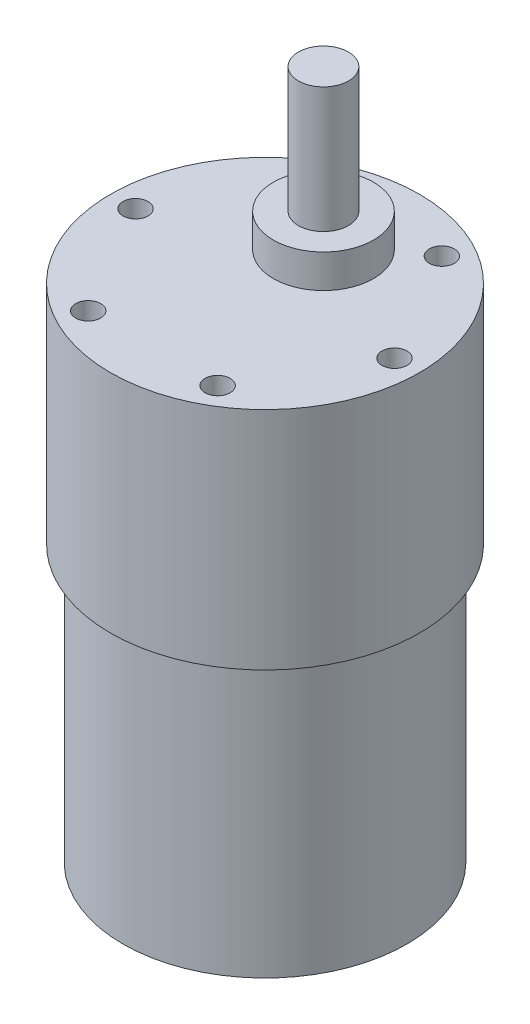
ISO-10303-21;
HEADER;
FILE_DESCRIPTION(('STEP AP214'),'2;1');
FILE_NAME('part.step','',(''),(''),'','','');
FILE_SCHEMA(('AUTOMOTIVE_DESIGN { 1 0 10303 214 1 1 1 1 }'));
ENDSEC;
DATA;
#1=APPLICATION_CONTEXT('core data for automotive mechanical design processes');
#2=APPLICATION_PROTOCOL_DEFINITION('international standard','automotive_design',2000,#1);
#3=PRODUCT_CONTEXT('',#1,'mechanical');
#4=PRODUCT('Part','Part','',(#3));
#5=PRODUCT_RELATED_PRODUCT_CATEGORY('part','',(#4));
#6=PRODUCT_DEFINITION_FORMATION('','',#4);
#7=PRODUCT_DEFINITION_CONTEXT('part definition',#1,'design');
#8=PRODUCT_DEFINITION('design','',#6,#7);
#9=PRODUCT_DEFINITION_SHAPE('','',#8);
#10=(LENGTH_UNIT() NAMED_UNIT(*) SI_UNIT(.MILLI.,.METRE.));
#11=(NAMED_UNIT(*) PLANE_ANGLE_UNIT() SI_UNIT($,.RADIAN.));
#12=(NAMED_UNIT(*) SI_UNIT($,.STERADIAN.) SOLID_ANGLE_UNIT());
#13=UNCERTAINTY_MEASURE_WITH_UNIT(LENGTH_MEASURE(1.E-05),#10,'distance_accuracy_value','');
#14=(GEOMETRIC_REPRESENTATION_CONTEXT(3) GLOBAL_UNCERTAINTY_ASSIGNED_CONTEXT((#13)) GLOBAL_UNIT_ASSIGNED_CONTEXT((#10,
#11,#12)) REPRESENTATION_CONTEXT('',''));
#15=CARTESIAN_POINT('',(0.,0.,0.));
#16=DIRECTION('',(0.,0.,1.));
#17=DIRECTION('',(1.,0.,0.));
#18=AXIS2_PLACEMENT_3D('',#15,#16,#17);
#19=CARTESIAN_POINT('',(0.,64.,-7.));
#20=DIRECTION('',(0.,1.,0.));
#21=DIRECTION('',(0.,0.,1.));
#22=AXIS2_PLACEMENT_3D('',#19,#20,#21);
#23=PLANE('',#22);
#24=CARTESIAN_POINT('',(0.,64.,-7.));
#25=DIRECTION('',(0.,1.,0.));
#26=DIRECTION('',(0.,0.,1.));
#27=AXIS2_PLACEMENT_3D('',#24,#25,#26);
#28=CIRCLE('',#27,6.);
#29=CARTESIAN_POINT('',(0.,64.,-0.999999999999999));
#30=VERTEX_POINT('',#29);
#31=EDGE_CURVE('E49',#30,#30,#28,.T.);
#32=ORIENTED_EDGE('',*,*,#31,.T.);
#33=EDGE_LOOP('',(#32));
#34=FACE_BOUND('',#33,.T.);
#35=CARTESIAN_POINT('',(0.,64.,-7.));
#36=DIRECTION('',(0.,1.,0.));
#37=DIRECTION('',(0.,0.,1.));
#38=AXIS2_PLACEMENT_3D('',#35,#36,#37);
#39=CIRCLE('',#38,3.);
#40=CARTESIAN_POINT('',(0.,64.,-4.));
#41=VERTEX_POINT('',#40);
#42=EDGE_CURVE('E58',#41,#41,#39,.T.);
#43=ORIENTED_EDGE('',*,*,#42,.F.);
#44=EDGE_LOOP('',(#43));
#45=FACE_BOUND('',#44,.T.);
#46=ADVANCED_FACE('F33',(#34,#45),#23,.T.);
#47=CARTESIAN_POINT('',(0.,60.,0.));
#48=DIRECTION('',(0.,1.,0.));
#49=DIRECTION('',(0.,0.,1.));
#50=AXIS2_PLACEMENT_3D('',#47,#48,#49);
#51=PLANE('',#50);
#52=CARTESIAN_POINT('',(-7.75000000000005,60.,-13.4233937586579));
#53=DIRECTION('',(0.,1.,0.));
#54=DIRECTION('',(0.,0.,1.));
#55=AXIS2_PLACEMENT_3D('',#52,#53,#54);
#56=CIRCLE('',#55,1.50000000000099);
#57=CARTESIAN_POINT('',(-7.75000000000005,60.,-11.9233937586569));
#58=VERTEX_POINT('',#57);
#59=EDGE_CURVE('E94',#58,#58,#56,.T.);
#60=ORIENTED_EDGE('',*,*,#59,.F.);
#61=EDGE_LOOP('',(#60));
#62=FACE_BOUND('',#61,.T.);
#63=CARTESIAN_POINT('',(-15.4999999999993,60.,1.36809671811449E-12));
#64=DIRECTION('',(0.,1.,0.));
#65=DIRECTION('',(0.,0.,1.));
#66=AXIS2_PLACEMENT_3D('',#63,#64,#65);
#67=CIRCLE('',#66,1.50000000000155);
#68=CARTESIAN_POINT('',(-15.4999999999993,60.,1.50000000000292));
#69=VERTEX_POINT('',#68);
#70=EDGE_CURVE('E88',#69,#69,#67,.T.);
#71=ORIENTED_EDGE('',*,*,#70,.F.);
#72=EDGE_LOOP('',(#71));
#73=FACE_BOUND('',#72,.T.);
#74=CARTESIAN_POINT('',(-7.74999999999845,60.,13.4233937586597));
#75=DIRECTION('',(0.,1.,0.));
#76=DIRECTION('',(0.,0.,1.));
#77=AXIS2_PLACEMENT_3D('',#74,#75,#76);
#78=CIRCLE('',#77,1.50000000000126);
#79=CARTESIAN_POINT('',(-7.74999999999845,60.,14.923393758661));
#80=VERTEX_POINT('',#79);
#81=EDGE_CURVE('E82',#80,#80,#78,.T.);
#82=ORIENTED_EDGE('',*,*,#81,.F.);
#83=EDGE_LOOP('',(#82));
#84=FACE_BOUND('',#83,.T.);
#85=CARTESIAN_POINT('',(7.75000000000155,60.,13.4233937586588));
#86=DIRECTION('',(0.,1.,0.));
#87=DIRECTION('',(0.,0.,1.));
#88=AXIS2_PLACEMENT_3D('',#85,#86,#87);
#89=CIRCLE('',#88,1.50000000000038);
#90=CARTESIAN_POINT('',(7.75000000000155,60.,14.9233937586592));
#91=VERTEX_POINT('',#90);
#92=EDGE_CURVE('E76',#91,#91,#89,.T.);
#93=ORIENTED_EDGE('',*,*,#92,.F.);
#94=EDGE_LOOP('',(#93));
#95=FACE_BOUND('',#94,.T.);
#96=CARTESIAN_POINT('',(15.5000000000008,60.,-4.75643164487524E-13));
#97=DIRECTION('',(0.,1.,0.));
#98=DIRECTION('',(0.,0.,1.));
#99=AXIS2_PLACEMENT_3D('',#96,#97,#98);
#100=CIRCLE('',#99,1.49999999999976);
#101=CARTESIAN_POINT('',(15.5000000000008,60.,1.49999999999929));
#102=VERTEX_POINT('',#101);
#103=EDGE_CURVE('E70',#102,#102,#100,.T.);
#104=ORIENTED_EDGE('',*,*,#103,.F.);
#105=EDGE_LOOP('',(#104));
#106=FACE_BOUND('',#105,.T.);
#107=CARTESIAN_POINT('',(7.74999999999997,60.,-13.4233937586588));
#108=DIRECTION('',(0.,1.,0.));
#109=DIRECTION('',(0.,0.,1.));
#110=AXIS2_PLACEMENT_3D('',#107,#108,#109);
#111=CIRCLE('',#110,1.5);
#112=CARTESIAN_POINT('',(7.74999999999997,60.,-11.9233937586588));
#113=VERTEX_POINT('',#112);
#114=EDGE_CURVE('E64',#113,#113,#111,.T.);
#115=ORIENTED_EDGE('',*,*,#114,.F.);
#116=EDGE_LOOP('',(#115));
#117=FACE_BOUND('',#116,.T.);
#118=CARTESIAN_POINT('',(0.,60.,0.));
#119=DIRECTION('',(0.,1.,0.));
#120=DIRECTION('',(0.,0.,1.));
#121=AXIS2_PLACEMENT_3D('',#118,#119,#120);
#122=CIRCLE('',#121,18.5);
#123=CARTESIAN_POINT('',(0.,60.,18.5));
#124=VERTEX_POINT('',#123);
#125=EDGE_CURVE('E44',#124,#124,#122,.T.);
#126=ORIENTED_EDGE('',*,*,#125,.T.);
#127=EDGE_LOOP('',(#126));
#128=FACE_BOUND('',#127,.T.);
#129=CARTESIAN_POINT('',(0.,60.,-7.));
#130=DIRECTION('',(0.,1.,0.));
#131=DIRECTION('',(0.,0.,1.));
#132=AXIS2_PLACEMENT_3D('',#129,#130,#131);
#133=CIRCLE('',#132,6.);
#134=CARTESIAN_POINT('',(0.,60.,-0.999999999999999));
#135=VERTEX_POINT('',#134);
#136=EDGE_CURVE('E52',#135,#135,#133,.T.);
#137=ORIENTED_EDGE('',*,*,#136,.F.);
#138=EDGE_LOOP('',(#137));
#139=FACE_BOUND('',#138,.T.);
#140=ADVANCED_FACE('F109',(#62,#73,#84,#95,#106,#117,#128,#139),#51,.T.);
#141=CARTESIAN_POINT('',(0.,33.,0.));
#142=DIRECTION('',(0.,-1.,0.));
#143=DIRECTION('',(0.,0.,-1.));
#144=AXIS2_PLACEMENT_3D('',#141,#142,#143);
#145=CYLINDRICAL_SURFACE('',#144,17.);
#146=CARTESIAN_POINT('',(0.,33.,0.));
#147=DIRECTION('',(0.,1.,0.));
#148=DIRECTION('',(0.,0.,1.));
#149=AXIS2_PLACEMENT_3D('',#146,#147,#148);
#150=CIRCLE('',#149,17.);
#151=CARTESIAN_POINT('',(0.,33.,17.));
#152=VERTEX_POINT('',#151);
#153=EDGE_CURVE('E10',#152,#152,#150,.T.);
#154=ORIENTED_EDGE('',*,*,#153,.F.);
#155=EDGE_LOOP('',(#154));
#156=FACE_BOUND('',#155,.T.);
#157=CARTESIAN_POINT('',(0.,0.,0.));
#158=DIRECTION('',(0.,1.,0.));
#159=DIRECTION('',(0.,0.,1.));
#160=AXIS2_PLACEMENT_3D('',#157,#158,#159);
#161=CIRCLE('',#160,17.);
#162=CARTESIAN_POINT('',(0.,0.,17.));
#163=VERTEX_POINT('',#162);
#164=EDGE_CURVE('E37',#163,#163,#161,.T.);
#165=ORIENTED_EDGE('',*,*,#164,.T.);
#166=EDGE_LOOP('',(#165));
#167=FACE_BOUND('',#166,.T.);
#168=ADVANCED_FACE('F35',(#156,#167),#145,.T.);
#169=CARTESIAN_POINT('',(0.,0.,0.));
#170=DIRECTION('',(0.,1.,0.));
#171=DIRECTION('',(0.,0.,1.));
#172=AXIS2_PLACEMENT_3D('',#169,#170,#171);
#173=PLANE('',#172);
#174=ORIENTED_EDGE('',*,*,#164,.F.);
#175=EDGE_LOOP('',(#174));
#176=FACE_BOUND('',#175,.T.);
#177=ADVANCED_FACE('F273',(#176),#173,.F.);
#178=CARTESIAN_POINT('',(0.,33.,0.));
#179=DIRECTION('',(0.,1.,0.));
#180=DIRECTION('',(0.,0.,1.));
#181=AXIS2_PLACEMENT_3D('',#178,#179,#180);
#182=PLANE('',#181);
#183=CARTESIAN_POINT('',(0.,33.,0.));
#184=DIRECTION('',(0.,1.,0.));
#185=DIRECTION('',(0.,0.,1.));
#186=AXIS2_PLACEMENT_3D('',#183,#184,#185);
#187=CIRCLE('',#186,18.5);
#188=CARTESIAN_POINT('',(0.,33.,18.5));
#189=VERTEX_POINT('',#188);
#190=EDGE_CURVE('E46',#189,#189,#187,.T.);
#191=ORIENTED_EDGE('',*,*,#190,.F.);
#192=EDGE_LOOP('',(#191));
#193=FACE_BOUND('',#192,.T.);
#194=ORIENTED_EDGE('',*,*,#153,.T.);
#195=EDGE_LOOP('',(#194));
#196=FACE_BOUND('',#195,.T.);
#197=ADVANCED_FACE('F140',(#193,#196),#182,.F.);
#198=CARTESIAN_POINT('',(0.,60.,0.));
#199=DIRECTION('',(0.,-1.,0.));
#200=DIRECTION('',(0.,0.,-1.));
#201=AXIS2_PLACEMENT_3D('',#198,#199,#200);
#202=CYLINDRICAL_SURFACE('',#201,18.5);
#203=ORIENTED_EDGE('',*,*,#125,.F.);
#204=EDGE_LOOP('',(#203));
#205=FACE_BOUND('',#204,.T.);
#206=ORIENTED_EDGE('',*,*,#190,.T.);
#207=EDGE_LOOP('',(#206));
#208=FACE_BOUND('',#207,.T.);
#209=ADVANCED_FACE('F130',(#205,#208),#202,.T.);
#210=CARTESIAN_POINT('',(0.,64.,-7.));
#211=DIRECTION('',(0.,-1.,0.));
#212=DIRECTION('',(0.,0.,-1.));
#213=AXIS2_PLACEMENT_3D('',#210,#211,#212);
#214=CYLINDRICAL_SURFACE('',#213,6.);
#215=ORIENTED_EDGE('',*,*,#31,.F.);
#216=EDGE_LOOP('',(#215));
#217=FACE_BOUND('',#216,.T.);
#218=ORIENTED_EDGE('',*,*,#136,.T.);
#219=EDGE_LOOP('',(#218));
#220=FACE_BOUND('',#219,.T.);
#221=ADVANCED_FACE('F127',(#217,#220),#214,.T.);
#222=CARTESIAN_POINT('',(0.,79.,-7.));
#223=DIRECTION('',(0.,-1.,0.));
#224=DIRECTION('',(0.,0.,-1.));
#225=AXIS2_PLACEMENT_3D('',#222,#223,#224);
#226=CYLINDRICAL_SURFACE('',#225,3.);
#227=CARTESIAN_POINT('',(0.,79.,-7.));
#228=DIRECTION('',(0.,1.,0.));
#229=DIRECTION('',(0.,0.,1.));
#230=AXIS2_PLACEMENT_3D('',#227,#228,#229);
#231=CIRCLE('',#230,3.);
#232=CARTESIAN_POINT('',(0.,79.,-4.));
#233=VERTEX_POINT('',#232);
#234=EDGE_CURVE('E55',#233,#233,#231,.T.);
#235=ORIENTED_EDGE('',*,*,#234,.F.);
#236=EDGE_LOOP('',(#235));
#237=FACE_BOUND('',#236,.T.);
#238=ORIENTED_EDGE('',*,*,#42,.T.);
#239=EDGE_LOOP('',(#238));
#240=FACE_BOUND('',#239,.T.);
#241=ADVANCED_FACE('F129',(#237,#240),#226,.T.);
#242=CARTESIAN_POINT('',(0.,79.,-7.));
#243=DIRECTION('',(0.,1.,0.));
#244=DIRECTION('',(0.,0.,1.));
#245=AXIS2_PLACEMENT_3D('',#242,#243,#244);
#246=PLANE('',#245);
#247=ORIENTED_EDGE('',*,*,#234,.T.);
#248=EDGE_LOOP('',(#247));
#249=FACE_BOUND('',#248,.T.);
#250=ADVANCED_FACE('F137',(#249),#246,.T.);
#251=CARTESIAN_POINT('',(7.74999999999997,55.,-13.4233937586588));
#252=DIRECTION('',(0.,1.,0.));
#253=DIRECTION('',(0.,0.,1.));
#254=AXIS2_PLACEMENT_3D('',#251,#252,#253);
#255=CYLINDRICAL_SURFACE('',#254,1.5);
#256=CARTESIAN_POINT('',(7.74999999999997,55.,-13.4233937586588));
#257=DIRECTION('',(0.,1.,0.));
#258=DIRECTION('',(0.,0.,1.));
#259=AXIS2_PLACEMENT_3D('',#256,#257,#258);
#260=CIRCLE('',#259,1.5);
#261=CARTESIAN_POINT('',(7.74999999999997,55.,-11.9233937586588));
#262=VERTEX_POINT('',#261);
#263=EDGE_CURVE('E61',#262,#262,#260,.T.);
#264=ORIENTED_EDGE('',*,*,#263,.F.);
#265=EDGE_LOOP('',(#264));
#266=FACE_BOUND('',#265,.T.);
#267=ORIENTED_EDGE('',*,*,#114,.T.);
#268=EDGE_LOOP('',(#267));
#269=FACE_BOUND('',#268,.T.);
#270=ADVANCED_FACE('F153',(#266,#269),#255,.F.);
#271=CARTESIAN_POINT('',(7.74999999999997,55.,-13.4233937586588));
#272=DIRECTION('',(0.,1.,0.));
#273=DIRECTION('',(0.,0.,1.));
#274=AXIS2_PLACEMENT_3D('',#271,#272,#273);
#275=PLANE('',#274);
#276=ORIENTED_EDGE('',*,*,#263,.T.);
#277=EDGE_LOOP('',(#276));
#278=FACE_BOUND('',#277,.T.);
#279=ADVANCED_FACE('F157',(#278),#275,.T.);
#280=CARTESIAN_POINT('',(15.5000000000008,55.,-4.75643164487524E-13));
#281=DIRECTION('',(0.,1.,0.));
#282=DIRECTION('',(0.,0.,1.));
#283=AXIS2_PLACEMENT_3D('',#280,#281,#282);
#284=CYLINDRICAL_SURFACE('',#283,1.49999999999976);
#285=CARTESIAN_POINT('',(15.5000000000008,55.,-4.75643164487524E-13));
#286=DIRECTION('',(0.,1.,0.));
#287=DIRECTION('',(0.,0.,1.));
#288=AXIS2_PLACEMENT_3D('',#285,#286,#287);
#289=CIRCLE('',#288,1.49999999999976);
#290=CARTESIAN_POINT('',(15.5000000000008,55.,1.49999999999929));
#291=VERTEX_POINT('',#290);
#292=EDGE_CURVE('E67',#291,#291,#289,.T.);
#293=ORIENTED_EDGE('',*,*,#292,.F.);
#294=EDGE_LOOP('',(#293));
#295=FACE_BOUND('',#294,.T.);
#296=ORIENTED_EDGE('',*,*,#103,.T.);
#297=EDGE_LOOP('',(#296));
#298=FACE_BOUND('',#297,.T.);
#299=ADVANCED_FACE('F161',(#295,#298),#284,.F.);
#300=CARTESIAN_POINT('',(15.5000000000008,55.,-4.75643164487524E-13));
#301=DIRECTION('',(0.,1.,0.));
#302=DIRECTION('',(0.,0.,1.));
#303=AXIS2_PLACEMENT_3D('',#300,#301,#302);
#304=PLANE('',#303);
#305=ORIENTED_EDGE('',*,*,#292,.T.);
#306=EDGE_LOOP('',(#305));
#307=FACE_BOUND('',#306,.T.);
#308=ADVANCED_FACE('F165',(#307),#304,.T.);
#309=CARTESIAN_POINT('',(7.75000000000155,55.,13.4233937586588));
#310=DIRECTION('',(0.,1.,0.));
#311=DIRECTION('',(0.,0.,1.));
#312=AXIS2_PLACEMENT_3D('',#309,#310,#311);
#313=CYLINDRICAL_SURFACE('',#312,1.50000000000038);
#314=CARTESIAN_POINT('',(7.75000000000155,55.,13.4233937586588));
#315=DIRECTION('',(0.,1.,0.));
#316=DIRECTION('',(0.,0.,1.));
#317=AXIS2_PLACEMENT_3D('',#314,#315,#316);
#318=CIRCLE('',#317,1.50000000000038);
#319=CARTESIAN_POINT('',(7.75000000000155,55.,14.9233937586592));
#320=VERTEX_POINT('',#319);
#321=EDGE_CURVE('E73',#320,#320,#318,.T.);
#322=ORIENTED_EDGE('',*,*,#321,.F.);
#323=EDGE_LOOP('',(#322));
#324=FACE_BOUND('',#323,.T.);
#325=ORIENTED_EDGE('',*,*,#92,.T.);
#326=EDGE_LOOP('',(#325));
#327=FACE_BOUND('',#326,.T.);
#328=ADVANCED_FACE('F169',(#324,#327),#313,.F.);
#329=CARTESIAN_POINT('',(7.75000000000155,55.,13.4233937586588));
#330=DIRECTION('',(0.,1.,0.));
#331=DIRECTION('',(0.,0.,1.));
#332=AXIS2_PLACEMENT_3D('',#329,#330,#331);
#333=PLANE('',#332);
#334=ORIENTED_EDGE('',*,*,#321,.T.);
#335=EDGE_LOOP('',(#334));
#336=FACE_BOUND('',#335,.T.);
#337=ADVANCED_FACE('F173',(#336),#333,.T.);
#338=CARTESIAN_POINT('',(-7.74999999999845,55.,13.4233937586597));
#339=DIRECTION('',(0.,1.,0.));
#340=DIRECTION('',(0.,0.,1.));
#341=AXIS2_PLACEMENT_3D('',#338,#339,#340);
#342=CYLINDRICAL_SURFACE('',#341,1.50000000000126);
#343=CARTESIAN_POINT('',(-7.74999999999845,55.,13.4233937586597));
#344=DIRECTION('',(0.,1.,0.));
#345=DIRECTION('',(0.,0.,1.));
#346=AXIS2_PLACEMENT_3D('',#343,#344,#345);
#347=CIRCLE('',#346,1.50000000000126);
#348=CARTESIAN_POINT('',(-7.74999999999845,55.,14.923393758661));
#349=VERTEX_POINT('',#348);
#350=EDGE_CURVE('E79',#349,#349,#347,.T.);
#351=ORIENTED_EDGE('',*,*,#350,.F.);
#352=EDGE_LOOP('',(#351));
#353=FACE_BOUND('',#352,.T.);
#354=ORIENTED_EDGE('',*,*,#81,.T.);
#355=EDGE_LOOP('',(#354));
#356=FACE_BOUND('',#355,.T.);
#357=ADVANCED_FACE('F177',(#353,#356),#342,.F.);
#358=CARTESIAN_POINT('',(-7.74999999999845,55.,13.4233937586597));
#359=DIRECTION('',(0.,1.,0.));
#360=DIRECTION('',(0.,0.,1.));
#361=AXIS2_PLACEMENT_3D('',#358,#359,#360);
#362=PLANE('',#361);
#363=ORIENTED_EDGE('',*,*,#350,.T.);
#364=EDGE_LOOP('',(#363));
#365=FACE_BOUND('',#364,.T.);
#366=ADVANCED_FACE('F181',(#365),#362,.T.);
#367=CARTESIAN_POINT('',(-15.4999999999993,55.,1.36809671811449E-12));
#368=DIRECTION('',(0.,1.,0.));
#369=DIRECTION('',(0.,0.,1.));
#370=AXIS2_PLACEMENT_3D('',#367,#368,#369);
#371=CYLINDRICAL_SURFACE('',#370,1.50000000000155);
#372=CARTESIAN_POINT('',(-15.4999999999993,55.,1.36809671811449E-12));
#373=DIRECTION('',(0.,1.,0.));
#374=DIRECTION('',(0.,0.,1.));
#375=AXIS2_PLACEMENT_3D('',#372,#373,#374);
#376=CIRCLE('',#375,1.50000000000155);
#377=CARTESIAN_POINT('',(-15.4999999999993,55.,1.50000000000292));
#378=VERTEX_POINT('',#377);
#379=EDGE_CURVE('E85',#378,#378,#376,.T.);
#380=ORIENTED_EDGE('',*,*,#379,.F.);
#381=EDGE_LOOP('',(#380));
#382=FACE_BOUND('',#381,.T.);
#383=ORIENTED_EDGE('',*,*,#70,.T.);
#384=EDGE_LOOP('',(#383));
#385=FACE_BOUND('',#384,.T.);
#386=ADVANCED_FACE('F185',(#382,#385),#371,.F.);
#387=CARTESIAN_POINT('',(-15.4999999999993,55.,1.36809671811449E-12));
#388=DIRECTION('',(0.,1.,0.));
#389=DIRECTION('',(0.,0.,1.));
#390=AXIS2_PLACEMENT_3D('',#387,#388,#389);
#391=PLANE('',#390);
#392=ORIENTED_EDGE('',*,*,#379,.T.);
#393=EDGE_LOOP('',(#392));
#394=FACE_BOUND('',#393,.T.);
#395=ADVANCED_FACE('F105',(#394),#391,.T.);
#396=CARTESIAN_POINT('',(-7.75000000000005,55.,-13.4233937586579));
#397=DIRECTION('',(0.,1.,0.));
#398=DIRECTION('',(0.,0.,1.));
#399=AXIS2_PLACEMENT_3D('',#396,#397,#398);
#400=CYLINDRICAL_SURFACE('',#399,1.50000000000099);
#401=CARTESIAN_POINT('',(-7.75000000000005,55.,-13.4233937586579));
#402=DIRECTION('',(0.,1.,0.));
#403=DIRECTION('',(0.,0.,1.));
#404=AXIS2_PLACEMENT_3D('',#401,#402,#403);
#405=CIRCLE('',#404,1.50000000000099);
#406=CARTESIAN_POINT('',(-7.75000000000005,55.,-11.9233937586569));
#407=VERTEX_POINT('',#406);
#408=EDGE_CURVE('E91',#407,#407,#405,.T.);
#409=ORIENTED_EDGE('',*,*,#408,.F.);
#410=EDGE_LOOP('',(#409));
#411=FACE_BOUND('',#410,.T.);
#412=ORIENTED_EDGE('',*,*,#59,.T.);
#413=EDGE_LOOP('',(#412));
#414=FACE_BOUND('',#413,.T.);
#415=ADVANCED_FACE('F102',(#411,#414),#400,.F.);
#416=CARTESIAN_POINT('',(-7.75000000000005,55.,-13.4233937586579));
#417=DIRECTION('',(0.,1.,0.));
#418=DIRECTION('',(0.,0.,1.));
#419=AXIS2_PLACEMENT_3D('',#416,#417,#418);
#420=PLANE('',#419);
#421=ORIENTED_EDGE('',*,*,#408,.T.);
#422=EDGE_LOOP('',(#421));
#423=FACE_BOUND('',#422,.T.);
#424=ADVANCED_FACE('F100',(#423),#420,.T.);
#425=CLOSED_SHELL('',(#46,#140,#168,#177,#197,#209,#221,#241,#250,#270,#279,#299,#308,#328,#337,
#357,#366,#386,#395,#415,#424));
#426=MANIFOLD_SOLID_BREP('B2',#425);
#427=ADVANCED_BREP_SHAPE_REPRESENTATION('',(#18,#426),#14);
#428=SHAPE_DEFINITION_REPRESENTATION(#9,#427);
ENDSEC;
END-ISO-10303-21;
